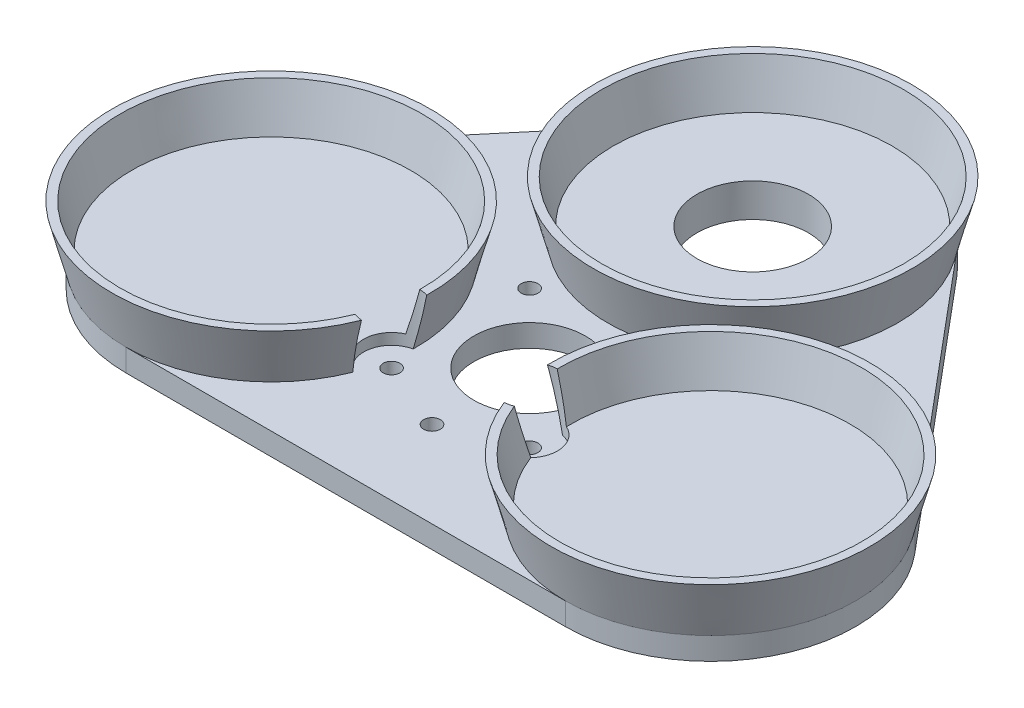
ISO-10303-21;
HEADER;
FILE_DESCRIPTION(('STEP AP214'),'2;1');
FILE_NAME('part.step','',(''),(''),'','','');
FILE_SCHEMA(('AUTOMOTIVE_DESIGN { 1 0 10303 214 1 1 1 1 }'));
ENDSEC;
DATA;
#1=APPLICATION_CONTEXT('core data for automotive mechanical design processes');
#2=APPLICATION_PROTOCOL_DEFINITION('international standard','automotive_design',2000,#1);
#3=PRODUCT_CONTEXT('',#1,'mechanical');
#4=PRODUCT('Part','Part','',(#3));
#5=PRODUCT_RELATED_PRODUCT_CATEGORY('part','',(#4));
#6=PRODUCT_DEFINITION_FORMATION('','',#4);
#7=PRODUCT_DEFINITION_CONTEXT('part definition',#1,'design');
#8=PRODUCT_DEFINITION('design','',#6,#7);
#9=PRODUCT_DEFINITION_SHAPE('','',#8);
#10=(LENGTH_UNIT() NAMED_UNIT(*) SI_UNIT(.MILLI.,.METRE.));
#11=(NAMED_UNIT(*) PLANE_ANGLE_UNIT() SI_UNIT($,.RADIAN.));
#12=(NAMED_UNIT(*) SI_UNIT($,.STERADIAN.) SOLID_ANGLE_UNIT());
#13=UNCERTAINTY_MEASURE_WITH_UNIT(LENGTH_MEASURE(1.E-05),#10,'distance_accuracy_value','');
#14=(GEOMETRIC_REPRESENTATION_CONTEXT(3) GLOBAL_UNCERTAINTY_ASSIGNED_CONTEXT((#13)) GLOBAL_UNIT_ASSIGNED_CONTEXT((#10,
#11,#12)) REPRESENTATION_CONTEXT('',''));
#15=CARTESIAN_POINT('',(0.,0.,0.));
#16=DIRECTION('',(0.,0.,1.));
#17=DIRECTION('',(1.,0.,0.));
#18=AXIS2_PLACEMENT_3D('',#15,#16,#17);
#19=CARTESIAN_POINT('',(-39.3923101204883,9.72740661031256,6.94592710667736));
#20=DIRECTION('',(0.,1.,0.));
#21=DIRECTION('',(0.984807753012207,0.,-0.173648177666934));
#22=AXIS2_PLACEMENT_3D('',#19,#20,#21);
#23=CONICAL_SURFACE('',#22,27.0705523608201,0.261799387799143);
#24=CARTESIAN_POINT('',(-39.3923101204883,9.72740661031256,6.94592710667736));
#25=DIRECTION('',(0.,-1.,0.));
#26=DIRECTION('',(-0.984807753012207,0.,0.173648177666934));
#27=AXIS2_PLACEMENT_3D('',#24,#25,#26);
#28=CIRCLE('',#27,27.0705523608201);
#29=CARTESIAN_POINT('',(-14.2601151995209,9.72740661031256,17.0051310301697));
#30=VERTEX_POINT('',#29);
#31=CARTESIAN_POINT('',(-12.3251522474625,9.72740661031256,7.37461090226448));
#32=VERTEX_POINT('',#31);
#33=EDGE_CURVE('E308',#30,#32,#28,.T.);
#34=ORIENTED_EDGE('',*,*,#33,.F.);
#35=CARTESIAN_POINT('',(-14.2600655661615,9.72760661031256,17.0051512416364));
#36=CARTESIAN_POINT('',(-14.3401976419316,9.40470816898464,16.9725164342048));
#37=CARTESIAN_POINT('',(-14.4194946879049,9.08181861347852,16.9378063994097));
#38=CARTESIAN_POINT('',(-14.5763991827393,8.43610466329445,16.8641989386838));
#39=CARTESIAN_POINT('',(-14.6540066232355,8.11328026894694,16.8253014920276));
#40=CARTESIAN_POINT('',(-14.8841287600299,7.14554965052471,16.7023454319672));
#41=CARTESIAN_POINT('',(-15.0340845894678,6.50081663974946,16.6119656955683));
#42=CARTESIAN_POINT('',(-15.2536440619608,5.53455915883508,16.4630814499572));
#43=CARTESIAN_POINT('',(-15.3259371332597,5.21260308153801,16.4112323343533));
#44=CARTESIAN_POINT('',(-15.4686712999778,4.5690607059439,16.3028953142026));
#45=CARTESIAN_POINT('',(-15.5391124160984,4.24747440355191,16.2464074615374));
#46=CARTESIAN_POINT('',(-15.6781287462537,3.60450502178904,16.1284991901627));
#47=CARTESIAN_POINT('',(-15.7467023182882,3.28312234942801,16.0670746071887));
#48=CARTESIAN_POINT('',(-15.881820018506,2.64096582360021,15.9389734226375));
#49=CARTESIAN_POINT('',(-15.9483640708069,2.32019199331712,15.8722966250168));
#50=CARTESIAN_POINT('',(-16.0138402851936,1.99979999999994,15.8028153114125));
#51=B_SPLINE_CURVE_WITH_KNOTS('',3,(#35,#36,#37,#38,#39,#40,#41,#42,#43,#44,#45,#46,#47,#48,#49,
#50),.UNSPECIFIED.,.F.,.F.,(4,2,2,2,2,2,2,4),(0.,1.00284888858753,2.00570274092708,
4.00964270612081,5.01167869362062,6.01370347544364,7.0165825465539,8.01949906878574),.UNSPECIFIED.);
#52=CARTESIAN_POINT('',(-16.0137994149528,2.,15.8028586967465));
#53=VERTEX_POINT('',#52);
#54=EDGE_CURVE('E271',#30,#53,#51,.T.);
#55=ORIENTED_EDGE('',*,*,#54,.T.);
#56=CARTESIAN_POINT('',(-39.3923101204883,2.,6.94592710667736));
#57=DIRECTION('',(0.,1.,0.));
#58=DIRECTION('',(0.,0.,1.));
#59=AXIS2_PLACEMENT_3D('',#56,#57,#58);
#60=CIRCLE('',#59,25.);
#61=CARTESIAN_POINT('',(-14.4071167597604,2.,7.80622515214748));
#62=VERTEX_POINT('',#61);
#63=EDGE_CURVE('E179',#53,#62,#60,.F.);
#64=ORIENTED_EDGE('',*,*,#63,.T.);
#65=CARTESIAN_POINT('',(-14.4071712157484,1.99980000000009,7.80624938454765));
#66=CARTESIAN_POINT('',(-14.3199392909982,2.32019199331719,7.76745017199079));
#67=CARTESIAN_POINT('',(-14.2328056347191,2.64096582360024,7.7316502811942));
#68=CARTESIAN_POINT('',(-14.0586949629365,3.28312234942802,7.66567922415418));
#69=CARTESIAN_POINT('',(-13.9717179417051,3.60450502178906,7.63550784777165));
#70=CARTESIAN_POINT('',(-13.797948178705,4.24747440355194,7.58044452081705));
#71=CARTESIAN_POINT('',(-13.711155343073,4.56906070594392,7.55554809492899));
#72=CARTESIAN_POINT('',(-13.5376531364761,5.21260308153803,7.51074924907529));
#73=CARTESIAN_POINT('',(-13.4509437664554,5.5345591588351,7.4908468849609));
#74=CARTESIAN_POINT('',(-13.1909170043141,6.50081663974948,7.43832104824259));
#75=CARTESIAN_POINT('',(-13.0176895250381,7.14554965052472,7.41287526357004));
#76=CARTESIAN_POINT('',(-12.7579345065733,8.11328026894694,7.38834526294325));
#77=CARTESIAN_POINT('',(-12.6713257365057,8.43610466329445,7.38244211766939));
#78=CARTESIAN_POINT('',(-12.4981670896661,9.08181861347851,7.37515090388513));
#79=CARTESIAN_POINT('',(-12.4116172126047,9.40470816898464,7.37376281302693));
#80=CARTESIAN_POINT('',(-12.3250986592624,9.72760661031254,7.37461143006116));
#81=B_SPLINE_CURVE_WITH_KNOTS('',3,(#65,#66,#67,#68,#69,#70,#71,#72,#73,#74,#75,#76,#77,#78,#79,
#80),.UNSPECIFIED.,.F.,.F.,(4,2,2,2,2,2,2,4),(0.,1.00291652223184,2.00579559334211,
3.00782037516513,4.00985636266493,6.01379632785865,7.01665018019819,8.01949906878572),.UNSPECIFIED.);
#82=EDGE_CURVE('E58',#62,#32,#81,.T.);
#83=ORIENTED_EDGE('',*,*,#82,.T.);
#84=EDGE_LOOP('',(#34,#55,#64,#83));
#85=FACE_BOUND('',#84,.T.);
#86=ADVANCED_FACE('F42',(#85),#23,.F.);
#87=CARTESIAN_POINT('',(-39.3923101204883,0.,6.94592710667736));
#88=DIRECTION('',(0.,1.,0.));
#89=DIRECTION('',(0.984807753012207,0.,-0.173648177666934));
#90=AXIS2_PLACEMENT_3D('',#87,#88,#89);
#91=CONICAL_SURFACE('',#90,26.,0.25835299681786);
#92=CARTESIAN_POINT('',(-39.3923101204883,9.72740661031256,6.94592710667736));
#93=DIRECTION('',(0.,-1.,0.));
#94=DIRECTION('',(-0.984807753012207,0.,0.173648177666934));
#95=AXIS2_PLACEMENT_3D('',#92,#93,#94);
#96=CIRCLE('',#95,28.5705523608201);
#97=CARTESIAN_POINT('',(-12.7863268878103,9.72740661031256,17.3573688139924));
#98=VERTEX_POINT('',#97);
#99=CARTESIAN_POINT('',(-10.8296860263977,9.72740661031256,7.61895538397324));
#100=VERTEX_POINT('',#99);
#101=EDGE_CURVE('E305',#98,#100,#96,.T.);
#102=ORIENTED_EDGE('',*,*,#101,.T.);
#103=CARTESIAN_POINT('',(-10.8296335615521,9.72760661031256,7.61897242624759));
#104=CARTESIAN_POINT('',(-10.9358008268356,9.32290237362259,7.58450271197082));
#105=CARTESIAN_POINT('',(-11.0421759634996,8.91793216598347,7.55386089376115));
#106=CARTESIAN_POINT('',(-11.2552487514101,8.10759913082861,7.49997745893563));
#107=CARTESIAN_POINT('',(-11.3619463910523,7.70223631778812,7.47673557917915));
#108=CARTESIAN_POINT('',(-11.575459122435,6.89168186058792,7.43741600337432));
#109=CARTESIAN_POINT('',(-11.6822739495732,6.48649053158333,7.42133032827775));
#110=CARTESIAN_POINT('',(-11.8960802866127,5.6759258628861,7.39613300698036));
#111=CARTESIAN_POINT('',(-12.0030718014418,5.27055251835473,7.38702155869862));
#112=CARTESIAN_POINT('',(-12.2172333454675,4.45954758989942,7.37568757244413));
#113=CARTESIAN_POINT('',(-12.3244034359033,4.05391597577354,7.37346836179419));
#114=CARTESIAN_POINT('',(-12.538842428166,3.24269329102045,7.375924611302));
#115=CARTESIAN_POINT('',(-12.6461113314316,2.83710222108201,7.38060017348585));
#116=CARTESIAN_POINT('',(-12.8607411848511,2.02604261623368,7.39691550845988));
#117=CARTESIAN_POINT('',(-12.9681021426842,1.62057409635626,7.40855593340414));
#118=CARTESIAN_POINT('',(-13.1829110265829,0.809933026909339,7.43898842398198));
#119=CARTESIAN_POINT('',(-13.2903589518637,0.404760474730257,7.45778042577766));
#120=CARTESIAN_POINT('',(-13.3978537968684,-0.000199999999996599,7.48024176225027));
#121=B_SPLINE_CURVE_WITH_KNOTS('',3,(#103,#104,#105,#106,#107,#108,#109,#110,#111,#112,#113,
#114,#115,#116,#117,#118,#119,#120),.UNSPECIFIED.,.F.,.F.,(4,2,2,2,2,2,2,2,4),(0.,
1.25942147196068,2.51879815408813,3.77676711135725,5.03477176675054,6.29338364691811,
7.55201415170976,8.81076252666348,10.0694996657777),.UNSPECIFIED.);
#122=CARTESIAN_POINT('',(-13.3978007057474,0.,7.48023065986106));
#123=VERTEX_POINT('',#122);
#124=EDGE_CURVE('E289',#100,#123,#121,.T.);
#125=ORIENTED_EDGE('',*,*,#124,.T.);
#126=CARTESIAN_POINT('',(-39.3923101204883,0.,6.94592710667726));
#127=DIRECTION('',(0.,1.,0.));
#128=DIRECTION('',(0.,0.,1.));
#129=AXIS2_PLACEMENT_3D('',#126,#127,#128);
#130=CIRCLE('',#129,26.);
#131=CARTESIAN_POINT('',(-59.3094656415816,0.,-9.76655074517278));
#132=VERTEX_POINT('',#131);
#133=EDGE_CURVE('E348',#123,#132,#130,.T.);
#134=ORIENTED_EDGE('',*,*,#133,.T.);
#135=CARTESIAN_POINT('',(-39.3923101204883,0.,6.94592710667736));
#136=DIRECTION('',(0.,-1.,0.));
#137=DIRECTION('',(-0.984807753012207,0.,0.173648177666934));
#138=AXIS2_PLACEMENT_3D('',#135,#136,#137);
#139=CIRCLE('',#138,26.);
#140=CARTESIAN_POINT('',(-39.3923101204883,0.,32.9459271066773));
#141=VERTEX_POINT('',#140);
#142=EDGE_CURVE('E302',#141,#132,#139,.T.);
#143=ORIENTED_EDGE('',*,*,#142,.F.);
#144=CARTESIAN_POINT('',(-15.20872564656,0.,16.4934001751063));
#145=VERTEX_POINT('',#144);
#146=EDGE_CURVE('E351',#141,#145,#130,.T.);
#147=ORIENTED_EDGE('',*,*,#146,.T.);
#148=CARTESIAN_POINT('',(-15.2087703292869,-0.000200000000001318,16.4933694280073));
#149=CARTESIAN_POINT('',(-15.1182932317789,0.404760474730253,16.5556072634874));
#150=CARTESIAN_POINT('',(-15.0264421417598,0.809933026909334,16.6144423995962));
#151=CARTESIAN_POINT('',(-14.8400579259285,1.62057409635625,16.7254825597795));
#152=CARTESIAN_POINT('',(-14.745524776183,2.02604261623367,16.7776875246671));
#153=CARTESIAN_POINT('',(-14.5538529823263,2.837102221082,16.8756369380085));
#154=CARTESIAN_POINT('',(-14.4567145830246,3.24269329102044,16.9213819909722));
#155=CARTESIAN_POINT('',(-14.2598658026267,4.05391597577353,17.0064741305631));
#156=CARTESIAN_POINT('',(-14.1601554596108,4.45954758989941,17.0458213118544));
#157=CARTESIAN_POINT('',(-13.9582361532006,5.27055251835472,17.1180862402963));
#158=CARTESIAN_POINT('',(-13.8560284184894,5.67592586288609,17.1510070802069));
#159=CARTESIAN_POINT('',(-13.6490820759568,6.48649053158332,17.2103473369571));
#160=CARTESIAN_POINT('',(-13.5443435400357,6.8916818605879,17.2367669382596));
#161=CARTESIAN_POINT('',(-13.3322133336348,7.70223631778811,17.2829674905972));
#162=CARTESIAN_POINT('',(-13.2248188253362,8.10759913082859,17.3027409795944));
#163=CARTESIAN_POINT('',(-13.0074691677653,8.91793216598344,17.3353379710262));
#164=CARTESIAN_POINT('',(-12.8975139275595,9.32290237362253,17.348161226259));
#165=CARTESIAN_POINT('',(-12.786271911953,9.72760661031244,17.3573733586914));
#166=B_SPLINE_CURVE_WITH_KNOTS('',3,(#148,#149,#150,#151,#152,#153,#154,#155,#156,#157,#158,
#159,#160,#161,#162,#163,#164,#165),.UNSPECIFIED.,.F.,.F.,(4,2,2,2,2,2,2,2,4),(0.,
1.25873713911423,2.51748551406795,3.7761160188596,5.03472789902717,6.29273255442046,
7.55070151168958,8.81007819381702,10.0694996657777),.UNSPECIFIED.);
#167=EDGE_CURVE('E282',#145,#98,#166,.T.);
#168=ORIENTED_EDGE('',*,*,#167,.T.);
#169=EDGE_LOOP('',(#102,#125,#134,#143,#147,#168));
#170=FACE_BOUND('',#169,.T.);
#171=ADVANCED_FACE('F252',(#170),#91,.T.);
#172=CARTESIAN_POINT('',(39.3923101204883,9.72740661031256,6.94592710667736));
#173=DIRECTION('',(0.,1.,0.));
#174=DIRECTION('',(-0.984807753012207,0.,-0.173648177666934));
#175=AXIS2_PLACEMENT_3D('',#172,#173,#174);
#176=CONICAL_SURFACE('',#175,27.0705523608201,0.261799387799143);
#177=CARTESIAN_POINT('',(39.3923101204883,9.72740661031256,6.94592710667736));
#178=DIRECTION('',(0.,-1.,0.));
#179=DIRECTION('',(0.984807753012207,0.,0.173648177666934));
#180=AXIS2_PLACEMENT_3D('',#177,#178,#179);
#181=CIRCLE('',#180,27.0705523608201);
#182=CARTESIAN_POINT('',(12.3251522474625,9.72740661031256,7.37461090226448));
#183=VERTEX_POINT('',#182);
#184=CARTESIAN_POINT('',(14.2601151995209,9.72740661031256,17.0051310301697));
#185=VERTEX_POINT('',#184);
#186=EDGE_CURVE('E194',#183,#185,#181,.T.);
#187=ORIENTED_EDGE('',*,*,#186,.F.);
#188=CARTESIAN_POINT('',(12.3250986592624,9.72760661031256,7.37461143006116));
#189=CARTESIAN_POINT('',(12.4116172126047,9.40470816898464,7.37376281302693));
#190=CARTESIAN_POINT('',(12.4981670896661,9.08181861347852,7.37515090388513));
#191=CARTESIAN_POINT('',(12.6713257365057,8.43610466329446,7.38244211766939));
#192=CARTESIAN_POINT('',(12.7579345065733,8.11328026894696,7.38834526294325));
#193=CARTESIAN_POINT('',(13.0176895250381,7.14554965052474,7.41287526357004));
#194=CARTESIAN_POINT('',(13.1909170043141,6.5008166397495,7.43832104824259));
#195=CARTESIAN_POINT('',(13.4509437664554,5.53455915883512,7.4908468849609));
#196=CARTESIAN_POINT('',(13.5376531364761,5.21260308153806,7.51074924907529));
#197=CARTESIAN_POINT('',(13.711155343073,4.56906070594395,7.55554809492898));
#198=CARTESIAN_POINT('',(13.797948178705,4.24747440355197,7.58044452081703));
#199=CARTESIAN_POINT('',(13.9717179417051,3.6045050217891,7.63550784777166));
#200=CARTESIAN_POINT('',(14.0586949629365,3.28312234942807,7.66567922415423));
#201=CARTESIAN_POINT('',(14.2328056347191,2.64096582360028,7.73165028119414));
#202=CARTESIAN_POINT('',(14.3199392909981,2.3201919933172,7.76745017199057));
#203=CARTESIAN_POINT('',(14.4071712157481,1.99980000000002,7.80624938454705));
#204=B_SPLINE_CURVE_WITH_KNOTS('',3,(#188,#189,#190,#191,#192,#193,#194,#195,#196,#197,#198,
#199,#200,#201,#202,#203),.UNSPECIFIED.,.F.,.F.,(4,2,2,2,2,2,2,4),(0.,1.00284888858752,
2.00570274092706,4.00964270612077,5.01167869362056,6.01370347544357,7.01658254655383,
8.01949906878565),.UNSPECIFIED.);
#205=CARTESIAN_POINT('',(14.4071167597604,2.,7.80622515214748));
#206=VERTEX_POINT('',#205);
#207=EDGE_CURVE('E193',#183,#206,#204,.T.);
#208=ORIENTED_EDGE('',*,*,#207,.T.);
#209=CARTESIAN_POINT('',(39.3923101204883,2.,6.94592710667736));
#210=DIRECTION('',(0.,1.,0.));
#211=DIRECTION('',(0.,0.,1.));
#212=AXIS2_PLACEMENT_3D('',#209,#210,#211);
#213=CIRCLE('',#212,25.);
#214=CARTESIAN_POINT('',(16.0137994149528,2.,15.8028586967465));
#215=VERTEX_POINT('',#214);
#216=EDGE_CURVE('E182',#206,#215,#213,.F.);
#217=ORIENTED_EDGE('',*,*,#216,.T.);
#218=CARTESIAN_POINT('',(16.0138402851936,1.99980000000001,15.8028153114118));
#219=CARTESIAN_POINT('',(15.9483640708069,2.32019199331711,15.8722966250165));
#220=CARTESIAN_POINT('',(15.881820018506,2.64096582360017,15.9389734226375));
#221=CARTESIAN_POINT('',(15.7467023182882,3.28312234942795,16.0670746071887));
#222=CARTESIAN_POINT('',(15.6781287462537,3.604505021789,16.1284991901627));
#223=CARTESIAN_POINT('',(15.5391124160984,4.24747440355188,16.2464074615374));
#224=CARTESIAN_POINT('',(15.4686712999778,4.56906070594387,16.3028953142026));
#225=CARTESIAN_POINT('',(15.3259371332597,5.21260308153799,16.4112323343533));
#226=CARTESIAN_POINT('',(15.2536440619608,5.53455915883506,16.4630814499572));
#227=CARTESIAN_POINT('',(15.0340845894678,6.50081663974945,16.6119656955683));
#228=CARTESIAN_POINT('',(14.8841287600299,7.14554965052469,16.7023454319672));
#229=CARTESIAN_POINT('',(14.6540066232355,8.11328026894693,16.8253014920276));
#230=CARTESIAN_POINT('',(14.5763991827393,8.43610466329444,16.8641989386838));
#231=CARTESIAN_POINT('',(14.4194946879049,9.08181861347851,16.9378063994097));
#232=CARTESIAN_POINT('',(14.3401976419315,9.40470816898464,16.9725164342048));
#233=CARTESIAN_POINT('',(14.2600655661614,9.72760661031255,17.0051512416365));
#234=B_SPLINE_CURVE_WITH_KNOTS('',3,(#218,#219,#220,#221,#222,#223,#224,#225,#226,#227,#228,
#229,#230,#231,#232,#233),.UNSPECIFIED.,.F.,.F.,(4,2,2,2,2,2,2,4),(0.,1.00291652223185,
2.00579559334213,3.00782037516516,4.00985636266497,6.01379632785871,7.01665018019826,
8.01949906878581),.UNSPECIFIED.);
#235=EDGE_CURVE('E65',#215,#185,#234,.T.);
#236=ORIENTED_EDGE('',*,*,#235,.T.);
#237=EDGE_LOOP('',(#187,#208,#217,#236));
#238=FACE_BOUND('',#237,.T.);
#239=ADVANCED_FACE('F191',(#238),#176,.F.);
#240=CARTESIAN_POINT('',(39.3923101204883,0.,6.94592710667736));
#241=DIRECTION('',(0.,1.,0.));
#242=DIRECTION('',(-0.984807753012207,0.,-0.173648177666934));
#243=AXIS2_PLACEMENT_3D('',#240,#241,#242);
#244=CONICAL_SURFACE('',#243,26.,0.25835299681786);
#245=CARTESIAN_POINT('',(39.3923101204883,9.72740661031256,6.94592710667736));
#246=DIRECTION('',(0.,-1.,0.));
#247=DIRECTION('',(0.984807753012207,0.,0.173648177666934));
#248=AXIS2_PLACEMENT_3D('',#245,#246,#247);
#249=CIRCLE('',#248,28.5705523608201);
#250=CARTESIAN_POINT('',(10.8296860263977,9.72740661031256,7.61895538397324));
#251=VERTEX_POINT('',#250);
#252=CARTESIAN_POINT('',(12.7863268878103,9.72740661031256,17.3573688139924));
#253=VERTEX_POINT('',#252);
#254=EDGE_CURVE('E160',#251,#253,#249,.T.);
#255=ORIENTED_EDGE('',*,*,#254,.T.);
#256=CARTESIAN_POINT('',(12.7862719119533,9.72760661031255,17.3573733586912));
#257=CARTESIAN_POINT('',(12.8975139275596,9.32290237362257,17.3481612262589));
#258=CARTESIAN_POINT('',(13.0074691677654,8.91793216598346,17.3353379710262));
#259=CARTESIAN_POINT('',(13.2248188253362,8.10759913082859,17.3027409795944));
#260=CARTESIAN_POINT('',(13.3322133336348,7.70223631778811,17.2829674905972));
#261=CARTESIAN_POINT('',(13.5443435400357,6.8916818605879,17.2367669382596));
#262=CARTESIAN_POINT('',(13.6490820759568,6.48649053158332,17.2103473369571));
#263=CARTESIAN_POINT('',(13.8560284184894,5.67592586288609,17.1510070802069));
#264=CARTESIAN_POINT('',(13.9582361532006,5.27055251835472,17.1180862402963));
#265=CARTESIAN_POINT('',(14.1601554596108,4.45954758989941,17.0458213118544));
#266=CARTESIAN_POINT('',(14.2598658026267,4.05391597577353,17.0064741305631));
#267=CARTESIAN_POINT('',(14.4567145830246,3.24269329102044,16.9213819909721));
#268=CARTESIAN_POINT('',(14.5538529823263,2.83710222108201,16.8756369380085));
#269=CARTESIAN_POINT('',(14.745524776183,2.02604261623367,16.7776875246671));
#270=CARTESIAN_POINT('',(14.8400579259285,1.62057409635626,16.7254825597795));
#271=CARTESIAN_POINT('',(15.0264421417598,0.809933026909338,16.6144423995962));
#272=CARTESIAN_POINT('',(15.1182932317789,0.404760474730255,16.5556072634874));
#273=CARTESIAN_POINT('',(15.2087703292869,-0.000199999999999226,16.4933694280073));
#274=B_SPLINE_CURVE_WITH_KNOTS('',3,(#256,#257,#258,#259,#260,#261,#262,#263,#264,#265,#266,
#267,#268,#269,#270,#271,#272,#273),.UNSPECIFIED.,.F.,.F.,(4,2,2,2,2,2,2,2,4),(0.,
1.25942147196068,2.51879815408812,3.77676711135725,5.03477176675053,6.2933836469181,
7.55201415170975,8.81076252666347,10.0694996657777),.UNSPECIFIED.);
#275=CARTESIAN_POINT('',(15.20872564656,0.,16.4934001751063));
#276=VERTEX_POINT('',#275);
#277=EDGE_CURVE('E144',#253,#276,#274,.T.);
#278=ORIENTED_EDGE('',*,*,#277,.T.);
#279=CARTESIAN_POINT('',(39.3923101204883,0.,6.94592710667723));
#280=DIRECTION('',(0.,-1.,0.));
#281=DIRECTION('',(0.,0.,-1.));
#282=AXIS2_PLACEMENT_3D('',#279,#280,#281);
#283=CIRCLE('',#282,26.);
#284=CARTESIAN_POINT('',(39.3923101204883,0.,32.9459271066774));
#285=VERTEX_POINT('',#284);
#286=EDGE_CURVE('E157',#276,#285,#283,.F.);
#287=ORIENTED_EDGE('',*,*,#286,.T.);
#288=CARTESIAN_POINT('',(39.3923101204883,0.,6.94592710667736));
#289=DIRECTION('',(0.,-1.,0.));
#290=DIRECTION('',(0.984807753012207,0.,0.173648177666934));
#291=AXIS2_PLACEMENT_3D('',#288,#289,#290);
#292=CIRCLE('',#291,26.);
#293=CARTESIAN_POINT('',(59.3094656415818,0.,-9.76655074517292));
#294=VERTEX_POINT('',#293);
#295=EDGE_CURVE('E298',#294,#285,#292,.T.);
#296=ORIENTED_EDGE('',*,*,#295,.F.);
#297=CARTESIAN_POINT('',(13.3978007057474,0.,7.48023065986106));
#298=VERTEX_POINT('',#297);
#299=EDGE_CURVE('E168',#294,#298,#283,.F.);
#300=ORIENTED_EDGE('',*,*,#299,.T.);
#301=CARTESIAN_POINT('',(13.3978537968684,-0.000199999999999493,7.48024176225027));
#302=CARTESIAN_POINT('',(13.2903589518637,0.404760474730254,7.45778042577766));
#303=CARTESIAN_POINT('',(13.1829110265829,0.809933026909337,7.43898842398198));
#304=CARTESIAN_POINT('',(12.9681021426842,1.62057409635626,7.40855593340414));
#305=CARTESIAN_POINT('',(12.8607411848511,2.02604261623368,7.39691550845988));
#306=CARTESIAN_POINT('',(12.6461113314316,2.83710222108201,7.38060017348585));
#307=CARTESIAN_POINT('',(12.538842428166,3.24269329102044,7.375924611302));
#308=CARTESIAN_POINT('',(12.3244034359033,4.05391597577353,7.37346836179419));
#309=CARTESIAN_POINT('',(12.2172333454675,4.45954758989941,7.37568757244413));
#310=CARTESIAN_POINT('',(12.0030718014418,5.27055251835472,7.38702155869862));
#311=CARTESIAN_POINT('',(11.8960802866127,5.6759258628861,7.39613300698036));
#312=CARTESIAN_POINT('',(11.6822739495732,6.48649053158332,7.42133032827774));
#313=CARTESIAN_POINT('',(11.575459122435,6.89168186058791,7.43741600337431));
#314=CARTESIAN_POINT('',(11.3619463910523,7.70223631778811,7.47673557917915));
#315=CARTESIAN_POINT('',(11.2552487514102,8.1075991308286,7.49997745893564));
#316=CARTESIAN_POINT('',(11.0421759634996,8.91793216598345,7.55386089376114));
#317=CARTESIAN_POINT('',(10.9358008268355,9.32290237362254,7.58450271197079));
#318=CARTESIAN_POINT('',(10.8296335615518,9.72760661031245,7.61897242624751));
#319=B_SPLINE_CURVE_WITH_KNOTS('',3,(#301,#302,#303,#304,#305,#306,#307,#308,#309,#310,#311,
#312,#313,#314,#315,#316,#317,#318),.UNSPECIFIED.,.F.,.F.,(4,2,2,2,2,2,2,2,4),(0.,
1.25873713911424,2.51748551406796,3.77611601885961,5.03472789902718,6.29273255442047,
7.55070151168959,8.81007819381703,10.0694996657777),.UNSPECIFIED.);
#320=EDGE_CURVE('E147',#298,#251,#319,.T.);
#321=ORIENTED_EDGE('',*,*,#320,.T.);
#322=EDGE_LOOP('',(#255,#278,#287,#296,#300,#321));
#323=FACE_BOUND('',#322,.T.);
#324=ADVANCED_FACE('F155',(#323),#244,.T.);
#325=CARTESIAN_POINT('',(0.,2.,-40.));
#326=DIRECTION('',(0.,-1.,0.));
#327=DIRECTION('',(0.,0.,-1.));
#328=AXIS2_PLACEMENT_3D('',#325,#326,#327);
#329=CYLINDRICAL_SURFACE('',#328,26.);
#330=DIRECTION('',(0.,1.,0.));
#331=VECTOR('',#330,1.);
#332=CARTESIAN_POINT('',(-19.9171555210934,-4.,-56.71247785185));
#333=LINE('',#332,#331);
#334=CARTESIAN_POINT('',(-19.9171555210934,-4.,-56.71247785185));
#335=VERTEX_POINT('',#334);
#336=CARTESIAN_POINT('',(-19.9171555210934,0.,-56.71247785185));
#337=VERTEX_POINT('',#336);
#338=EDGE_CURVE('E375',#335,#337,#333,.T.);
#339=ORIENTED_EDGE('',*,*,#338,.T.);
#340=CARTESIAN_POINT('',(0.,0.,-40.));
#341=DIRECTION('',(0.,-1.,0.));
#342=DIRECTION('',(0.,0.,-1.));
#343=AXIS2_PLACEMENT_3D('',#340,#341,#342);
#344=CIRCLE('',#343,26.);
#345=CARTESIAN_POINT('',(19.9171555210934,0.,-56.7124778518501));
#346=VERTEX_POINT('',#345);
#347=EDGE_CURVE('E311',#337,#346,#344,.T.);
#348=ORIENTED_EDGE('',*,*,#347,.T.);
#349=DIRECTION('',(0.,1.,0.));
#350=VECTOR('',#349,1.);
#351=CARTESIAN_POINT('',(19.9171555210934,-4.,-56.71247785185));
#352=LINE('',#351,#350);
#353=CARTESIAN_POINT('',(19.9171555210934,-4.,-56.71247785185));
#354=VERTEX_POINT('',#353);
#355=EDGE_CURVE('E173',#354,#346,#352,.T.);
#356=ORIENTED_EDGE('',*,*,#355,.F.);
#357=CARTESIAN_POINT('',(0.,-4.,-40.));
#358=DIRECTION('',(0.,-1.,0.));
#359=DIRECTION('',(0.,0.,-1.));
#360=AXIS2_PLACEMENT_3D('',#357,#358,#359);
#361=CIRCLE('',#360,26.);
#362=EDGE_CURVE('E358',#354,#335,#361,.F.);
#363=ORIENTED_EDGE('',*,*,#362,.T.);
#364=EDGE_LOOP('',(#339,#348,#356,#363));
#365=FACE_BOUND('',#364,.T.);
#366=ADVANCED_FACE('F44',(#365),#329,.T.);
#367=CARTESIAN_POINT('',(39.6133105813376,-4.,-33.2395142985116));
#368=DIRECTION('',(0.766044443118976,0.,-0.642787609686542));
#369=DIRECTION('',(-0.642787609686542,0.,-0.766044443118976));
#370=AXIS2_PLACEMENT_3D('',#367,#368,#369);
#371=PLANE('',#370);
#372=DIRECTION('',(-0.642787609686542,0.,-0.766044443118976));
#373=VECTOR('',#372,1.);
#374=CARTESIAN_POINT('',(39.6133105813376,0.,-33.2395142985116));
#375=LINE('',#374,#373);
#376=EDGE_CURVE('E378',#294,#346,#375,.T.);
#377=ORIENTED_EDGE('',*,*,#376,.F.);
#378=DIRECTION('',(0.,1.,0.));
#379=VECTOR('',#378,1.);
#380=CARTESIAN_POINT('',(59.3094656415818,-4.,-9.76655074517292));
#381=LINE('',#380,#379);
#382=CARTESIAN_POINT('',(59.3094656415818,-4.,-9.76655074517292));
#383=VERTEX_POINT('',#382);
#384=EDGE_CURVE('E394',#383,#294,#381,.T.);
#385=ORIENTED_EDGE('',*,*,#384,.F.);
#386=DIRECTION('',(-0.642787609686542,0.,-0.766044443118976));
#387=VECTOR('',#386,1.);
#388=CARTESIAN_POINT('',(39.6133105813376,-4.,-33.2395142985116));
#389=LINE('',#388,#387);
#390=EDGE_CURVE('E362',#383,#354,#389,.T.);
#391=ORIENTED_EDGE('',*,*,#390,.T.);
#392=ORIENTED_EDGE('',*,*,#355,.T.);
#393=EDGE_LOOP('',(#377,#385,#391,#392));
#394=FACE_BOUND('',#393,.T.);
#395=ADVANCED_FACE('F398',(#394),#371,.T.);
#396=CARTESIAN_POINT('',(39.3923101204883,-4.,6.94592710667723));
#397=DIRECTION('',(0.,1.,0.));
#398=DIRECTION('',(0.,0.,1.));
#399=AXIS2_PLACEMENT_3D('',#396,#397,#398);
#400=CYLINDRICAL_SURFACE('',#399,26.);
#401=ORIENTED_EDGE('',*,*,#384,.T.);
#402=ORIENTED_EDGE('',*,*,#295,.T.);
#403=DIRECTION('',(0.,1.,0.));
#404=VECTOR('',#403,1.);
#405=CARTESIAN_POINT('',(39.3923101204883,-4.,32.9459271066772));
#406=LINE('',#405,#404);
#407=CARTESIAN_POINT('',(39.3923101204883,-4.,32.9459271066772));
#408=VERTEX_POINT('',#407);
#409=EDGE_CURVE('E392',#408,#285,#406,.T.);
#410=ORIENTED_EDGE('',*,*,#409,.F.);
#411=CARTESIAN_POINT('',(39.3923101204883,-4.,6.94592710667723));
#412=DIRECTION('',(0.,-1.,0.));
#413=DIRECTION('',(0.,0.,-1.));
#414=AXIS2_PLACEMENT_3D('',#411,#412,#413);
#415=CIRCLE('',#414,26.);
#416=EDGE_CURVE('E365',#383,#408,#415,.T.);
#417=ORIENTED_EDGE('',*,*,#416,.F.);
#418=EDGE_LOOP('',(#401,#402,#410,#417));
#419=FACE_BOUND('',#418,.T.);
#420=ADVANCED_FACE('F463',(#419),#400,.T.);
#421=CARTESIAN_POINT('',(0.,-4.,32.9459271066773));
#422=DIRECTION('',(0.,0.,1.));
#423=DIRECTION('',(1.,0.,0.));
#424=AXIS2_PLACEMENT_3D('',#421,#422,#423);
#425=PLANE('',#424);
#426=DIRECTION('',(1.,0.,0.));
#427=VECTOR('',#426,1.);
#428=CARTESIAN_POINT('',(0.,0.,32.9459271066773));
#429=LINE('',#428,#427);
#430=EDGE_CURVE('E166',#141,#285,#429,.T.);
#431=ORIENTED_EDGE('',*,*,#430,.F.);
#432=DIRECTION('',(0.,1.,0.));
#433=VECTOR('',#432,1.);
#434=CARTESIAN_POINT('',(-39.3923101204883,-4.,32.9459271066773));
#435=LINE('',#434,#433);
#436=CARTESIAN_POINT('',(-39.3923101204883,-4.,32.9459271066773));
#437=VERTEX_POINT('',#436);
#438=EDGE_CURVE('E389',#437,#141,#435,.T.);
#439=ORIENTED_EDGE('',*,*,#438,.F.);
#440=DIRECTION('',(1.,0.,0.));
#441=VECTOR('',#440,1.);
#442=CARTESIAN_POINT('',(0.,-4.,32.9459271066773));
#443=LINE('',#442,#441);
#444=EDGE_CURVE('E367',#437,#408,#443,.T.);
#445=ORIENTED_EDGE('',*,*,#444,.T.);
#446=ORIENTED_EDGE('',*,*,#409,.T.);
#447=EDGE_LOOP('',(#431,#439,#445,#446));
#448=FACE_BOUND('',#447,.T.);
#449=ADVANCED_FACE('F459',(#448),#425,.T.);
#450=CARTESIAN_POINT('',(-39.3923101204883,-4.,6.94592710667726));
#451=DIRECTION('',(0.,1.,0.));
#452=DIRECTION('',(0.,0.,1.));
#453=AXIS2_PLACEMENT_3D('',#450,#451,#452);
#454=CYLINDRICAL_SURFACE('',#453,26.0000000000001);
#455=ORIENTED_EDGE('',*,*,#142,.T.);
#456=DIRECTION('',(0.,1.,0.));
#457=VECTOR('',#456,1.);
#458=CARTESIAN_POINT('',(-59.3094656415819,-4.,-9.76655074517291));
#459=LINE('',#458,#457);
#460=CARTESIAN_POINT('',(-59.3094656415819,-4.,-9.76655074517291));
#461=VERTEX_POINT('',#460);
#462=EDGE_CURVE('E386',#461,#132,#459,.T.);
#463=ORIENTED_EDGE('',*,*,#462,.F.);
#464=CARTESIAN_POINT('',(-39.3923101204883,-4.,6.94592710667726));
#465=DIRECTION('',(0.,-1.,0.));
#466=DIRECTION('',(0.,0.,-1.));
#467=AXIS2_PLACEMENT_3D('',#464,#465,#466);
#468=CIRCLE('',#467,26.0000000000001);
#469=EDGE_CURVE('E370',#461,#437,#468,.F.);
#470=ORIENTED_EDGE('',*,*,#469,.T.);
#471=ORIENTED_EDGE('',*,*,#438,.T.);
#472=EDGE_LOOP('',(#455,#463,#470,#471));
#473=FACE_BOUND('',#472,.T.);
#474=ADVANCED_FACE('F456',(#473),#454,.T.);
#475=CARTESIAN_POINT('',(0.,-4.,0.));
#476=DIRECTION('',(0.,1.,0.));
#477=DIRECTION('',(0.,0.,1.));
#478=AXIS2_PLACEMENT_3D('',#475,#476,#477);
#479=CYLINDRICAL_SURFACE('',#478,10.);
#480=CARTESIAN_POINT('',(0.,-4.,0.));
#481=DIRECTION('',(0.,-1.,0.));
#482=DIRECTION('',(0.,0.,-1.));
#483=AXIS2_PLACEMENT_3D('',#480,#481,#482);
#484=CIRCLE('',#483,10.);
#485=CARTESIAN_POINT('',(0.,-4.,-10.));
#486=VERTEX_POINT('',#485);
#487=EDGE_CURVE('E355',#486,#486,#484,.T.);
#488=ORIENTED_EDGE('',*,*,#487,.T.);
#489=EDGE_LOOP('',(#488));
#490=FACE_BOUND('',#489,.T.);
#491=CARTESIAN_POINT('',(0.,0.,0.));
#492=DIRECTION('',(0.,-1.,0.));
#493=DIRECTION('',(0.,0.,-1.));
#494=AXIS2_PLACEMENT_3D('',#491,#492,#493);
#495=CIRCLE('',#494,10.);
#496=CARTESIAN_POINT('',(0.,0.,-10.));
#497=VERTEX_POINT('',#496);
#498=EDGE_CURVE('E354',#497,#497,#495,.T.);
#499=ORIENTED_EDGE('',*,*,#498,.F.);
#500=EDGE_LOOP('',(#499));
#501=FACE_BOUND('',#500,.T.);
#502=ADVANCED_FACE('F454',(#490,#501),#479,.F.);
#503=CARTESIAN_POINT('',(-39.6133105813376,-4.,-33.2395142985116));
#504=DIRECTION('',(0.766044443118976,0.,0.642787609686542));
#505=DIRECTION('',(0.642787609686542,0.,-0.766044443118976));
#506=AXIS2_PLACEMENT_3D('',#503,#504,#505);
#507=PLANE('',#506);
#508=DIRECTION('',(0.642787609686542,0.,-0.766044443118976));
#509=VECTOR('',#508,1.);
#510=CARTESIAN_POINT('',(-39.6133105813376,0.,-33.2395142985116));
#511=LINE('',#510,#509);
#512=EDGE_CURVE('E359',#132,#337,#511,.T.);
#513=ORIENTED_EDGE('',*,*,#512,.T.);
#514=ORIENTED_EDGE('',*,*,#338,.F.);
#515=DIRECTION('',(0.642787609686542,0.,-0.766044443118976));
#516=VECTOR('',#515,1.);
#517=CARTESIAN_POINT('',(-39.6133105813376,-4.,-33.2395142985116));
#518=LINE('',#517,#516);
#519=EDGE_CURVE('E373',#461,#335,#518,.T.);
#520=ORIENTED_EDGE('',*,*,#519,.F.);
#521=ORIENTED_EDGE('',*,*,#462,.T.);
#522=EDGE_LOOP('',(#513,#514,#520,#521));
#523=FACE_BOUND('',#522,.T.);
#524=ADVANCED_FACE('F448',(#523),#507,.F.);
#525=CARTESIAN_POINT('',(0.,-4.,0.));
#526=DIRECTION('',(0.,-1.,0.));
#527=DIRECTION('',(0.,0.,-1.));
#528=AXIS2_PLACEMENT_3D('',#525,#526,#527);
#529=PLANE('',#528);
#530=CARTESIAN_POINT('',(0.,-4.,-40.));
#531=DIRECTION('',(0.,-1.,0.));
#532=DIRECTION('',(0.,0.,-1.));
#533=AXIS2_PLACEMENT_3D('',#530,#531,#532);
#534=CIRCLE('',#533,10.);
#535=CARTESIAN_POINT('',(0.,-4.,-50.));
#536=VERTEX_POINT('',#535);
#537=EDGE_CURVE('E46',#536,#536,#534,.T.);
#538=ORIENTED_EDGE('',*,*,#537,.F.);
#539=EDGE_LOOP('',(#538));
#540=FACE_BOUND('',#539,.T.);
#541=CARTESIAN_POINT('',(0.,-4.,17.5));
#542=DIRECTION('',(0.,1.,0.));
#543=DIRECTION('',(0.,0.,1.));
#544=AXIS2_PLACEMENT_3D('',#541,#542,#543);
#545=CIRCLE('',#544,1.5);
#546=CARTESIAN_POINT('',(0.,-4.,19.));
#547=VERTEX_POINT('',#546);
#548=EDGE_CURVE('E337',#547,#547,#545,.T.);
#549=ORIENTED_EDGE('',*,*,#548,.T.);
#550=EDGE_LOOP('',(#549));
#551=FACE_BOUND('',#550,.T.);
#552=CARTESIAN_POINT('',(-12.3743686707646,-4.,-12.3743686707646));
#553=DIRECTION('',(0.,1.,0.));
#554=DIRECTION('',(0.,0.,-1.));
#555=AXIS2_PLACEMENT_3D('',#552,#553,#554);
#556=CIRCLE('',#555,1.5);
#557=CARTESIAN_POINT('',(-12.3743686707646,-4.,-13.8743686707646));
#558=VERTEX_POINT('',#557);
#559=EDGE_CURVE('E324',#558,#558,#556,.T.);
#560=ORIENTED_EDGE('',*,*,#559,.T.);
#561=EDGE_LOOP('',(#560));
#562=FACE_BOUND('',#561,.T.);
#563=CARTESIAN_POINT('',(-12.3743686707646,-4.,12.3743686707646));
#564=DIRECTION('',(0.,1.,0.));
#565=DIRECTION('',(0.,0.,1.));
#566=AXIS2_PLACEMENT_3D('',#563,#564,#565);
#567=CIRCLE('',#566,1.5);
#568=CARTESIAN_POINT('',(-12.3743686707646,-4.,13.8743686707646));
#569=VERTEX_POINT('',#568);
#570=EDGE_CURVE('E325',#569,#569,#567,.T.);
#571=ORIENTED_EDGE('',*,*,#570,.T.);
#572=EDGE_LOOP('',(#571));
#573=FACE_BOUND('',#572,.T.);
#574=CARTESIAN_POINT('',(12.3743686707646,-4.,12.3743686707646));
#575=DIRECTION('',(0.,1.,0.));
#576=DIRECTION('',(0.,0.,-1.));
#577=AXIS2_PLACEMENT_3D('',#574,#575,#576);
#578=CIRCLE('',#577,1.5);
#579=CARTESIAN_POINT('',(12.3743686707646,-4.,10.8743686707646));
#580=VERTEX_POINT('',#579);
#581=EDGE_CURVE('E320',#580,#580,#578,.T.);
#582=ORIENTED_EDGE('',*,*,#581,.T.);
#583=EDGE_LOOP('',(#582));
#584=FACE_BOUND('',#583,.T.);
#585=CARTESIAN_POINT('',(12.3743686707646,-4.,-12.3743686707646));
#586=DIRECTION('',(0.,1.,0.));
#587=DIRECTION('',(0.,0.,1.));
#588=AXIS2_PLACEMENT_3D('',#585,#586,#587);
#589=CIRCLE('',#588,1.5);
#590=CARTESIAN_POINT('',(12.3743686707646,-4.,-10.8743686707646));
#591=VERTEX_POINT('',#590);
#592=EDGE_CURVE('E345',#591,#591,#589,.T.);
#593=ORIENTED_EDGE('',*,*,#592,.T.);
#594=EDGE_LOOP('',(#593));
#595=FACE_BOUND('',#594,.T.);
#596=ORIENTED_EDGE('',*,*,#487,.F.);
#597=EDGE_LOOP('',(#596));
#598=FACE_BOUND('',#597,.T.);
#599=ORIENTED_EDGE('',*,*,#362,.F.);
#600=ORIENTED_EDGE('',*,*,#390,.F.);
#601=ORIENTED_EDGE('',*,*,#416,.T.);
#602=ORIENTED_EDGE('',*,*,#444,.F.);
#603=ORIENTED_EDGE('',*,*,#469,.F.);
#604=ORIENTED_EDGE('',*,*,#519,.T.);
#605=EDGE_LOOP('',(#599,#600,#601,#602,#603,#604));
#606=FACE_BOUND('',#605,.T.);
#607=ADVANCED_FACE('F445',(#540,#551,#562,#573,#584,#595,#598,#606),#529,.T.);
#608=CARTESIAN_POINT('',(0.,0.,0.));
#609=DIRECTION('',(0.,-1.,0.));
#610=DIRECTION('',(0.,0.,-1.));
#611=AXIS2_PLACEMENT_3D('',#608,#609,#610);
#612=PLANE('',#611);
#613=ORIENTED_EDGE('',*,*,#286,.F.);
#614=CARTESIAN_POINT('',(12.3743686707646,0.,12.3743686707646));
#615=DIRECTION('',(0.,1.,0.));
#616=DIRECTION('',(0.,0.,1.));
#617=AXIS2_PLACEMENT_3D('',#614,#615,#616);
#618=CIRCLE('',#617,5.);
#619=EDGE_CURVE('E141',#276,#298,#618,.T.);
#620=ORIENTED_EDGE('',*,*,#619,.T.);
#621=ORIENTED_EDGE('',*,*,#299,.F.);
#622=ORIENTED_EDGE('',*,*,#376,.T.);
#623=CARTESIAN_POINT('',(0.,0.,-40.));
#624=DIRECTION('',(0.,1.,0.));
#625=DIRECTION('',(0.,0.,1.));
#626=AXIS2_PLACEMENT_3D('',#623,#624,#625);
#627=CIRCLE('',#626,26.);
#628=EDGE_CURVE('E169',#337,#346,#627,.T.);
#629=ORIENTED_EDGE('',*,*,#628,.F.);
#630=ORIENTED_EDGE('',*,*,#512,.F.);
#631=ORIENTED_EDGE('',*,*,#133,.F.);
#632=CARTESIAN_POINT('',(-12.3743686707646,0.,12.3743686707646));
#633=DIRECTION('',(0.,1.,0.));
#634=DIRECTION('',(0.,0.,-1.));
#635=AXIS2_PLACEMENT_3D('',#632,#633,#634);
#636=CIRCLE('',#635,5.);
#637=EDGE_CURVE('E151',#123,#145,#636,.T.);
#638=ORIENTED_EDGE('',*,*,#637,.T.);
#639=ORIENTED_EDGE('',*,*,#146,.F.);
#640=ORIENTED_EDGE('',*,*,#430,.T.);
#641=EDGE_LOOP('',(#613,#620,#621,#622,#629,#630,#631,#638,#639,#640));
#642=FACE_BOUND('',#641,.T.);
#643=CARTESIAN_POINT('',(0.,0.,17.5));
#644=DIRECTION('',(0.,1.,0.));
#645=DIRECTION('',(0.,0.,1.));
#646=AXIS2_PLACEMENT_3D('',#643,#644,#645);
#647=CIRCLE('',#646,1.5);
#648=CARTESIAN_POINT('',(0.,0.,19.));
#649=VERTEX_POINT('',#648);
#650=EDGE_CURVE('E333',#649,#649,#647,.T.);
#651=ORIENTED_EDGE('',*,*,#650,.F.);
#652=EDGE_LOOP('',(#651));
#653=FACE_BOUND('',#652,.T.);
#654=CARTESIAN_POINT('',(-12.3743686707646,0.,-12.3743686707646));
#655=DIRECTION('',(0.,1.,0.));
#656=DIRECTION('',(0.,0.,-1.));
#657=AXIS2_PLACEMENT_3D('',#654,#655,#656);
#658=CIRCLE('',#657,1.5);
#659=CARTESIAN_POINT('',(-12.3743686707646,0.,-13.8743686707646));
#660=VERTEX_POINT('',#659);
#661=EDGE_CURVE('E340',#660,#660,#658,.T.);
#662=ORIENTED_EDGE('',*,*,#661,.F.);
#663=EDGE_LOOP('',(#662));
#664=FACE_BOUND('',#663,.T.);
#665=CARTESIAN_POINT('',(12.3743686707646,0.,-12.3743686707646));
#666=DIRECTION('',(0.,1.,0.));
#667=DIRECTION('',(0.,0.,1.));
#668=AXIS2_PLACEMENT_3D('',#665,#666,#667);
#669=CIRCLE('',#668,1.5);
#670=CARTESIAN_POINT('',(12.3743686707646,0.,-10.8743686707646));
#671=VERTEX_POINT('',#670);
#672=EDGE_CURVE('E336',#671,#671,#669,.T.);
#673=ORIENTED_EDGE('',*,*,#672,.F.);
#674=EDGE_LOOP('',(#673));
#675=FACE_BOUND('',#674,.T.);
#676=ORIENTED_EDGE('',*,*,#498,.T.);
#677=EDGE_LOOP('',(#676));
#678=FACE_BOUND('',#677,.T.);
#679=CARTESIAN_POINT('',(-12.3743686707646,0.,12.3743686707646));
#680=DIRECTION('',(0.,1.,0.));
#681=DIRECTION('',(0.,0.,1.));
#682=AXIS2_PLACEMENT_3D('',#679,#680,#681);
#683=CIRCLE('',#682,1.5);
#684=CARTESIAN_POINT('',(-12.3743686707646,0.,13.8743686707646));
#685=VERTEX_POINT('',#684);
#686=EDGE_CURVE('E321',#685,#685,#683,.T.);
#687=ORIENTED_EDGE('',*,*,#686,.F.);
#688=EDGE_LOOP('',(#687));
#689=FACE_BOUND('',#688,.T.);
#690=CARTESIAN_POINT('',(12.3743686707646,0.,12.3743686707646));
#691=DIRECTION('',(0.,1.,0.));
#692=DIRECTION('',(0.,0.,-1.));
#693=AXIS2_PLACEMENT_3D('',#690,#691,#692);
#694=CIRCLE('',#693,1.5);
#695=CARTESIAN_POINT('',(12.3743686707646,0.,10.8743686707646));
#696=VERTEX_POINT('',#695);
#697=EDGE_CURVE('E328',#696,#696,#694,.T.);
#698=ORIENTED_EDGE('',*,*,#697,.F.);
#699=EDGE_LOOP('',(#698));
#700=FACE_BOUND('',#699,.T.);
#701=ADVANCED_FACE('F163',(#642,#653,#664,#675,#678,#689,#700),#612,.F.);
#702=CARTESIAN_POINT('',(12.3743686707646,-4.,-12.3743686707646));
#703=DIRECTION('',(0.,1.,0.));
#704=DIRECTION('',(0.,0.,1.));
#705=AXIS2_PLACEMENT_3D('',#702,#703,#704);
#706=CYLINDRICAL_SURFACE('',#705,1.5);
#707=ORIENTED_EDGE('',*,*,#592,.F.);
#708=EDGE_LOOP('',(#707));
#709=FACE_BOUND('',#708,.T.);
#710=ORIENTED_EDGE('',*,*,#672,.T.);
#711=EDGE_LOOP('',(#710));
#712=FACE_BOUND('',#711,.T.);
#713=ADVANCED_FACE('F434',(#709,#712),#706,.F.);
#714=CARTESIAN_POINT('',(12.3743686707646,-4.,12.3743686707646));
#715=DIRECTION('',(0.,1.,0.));
#716=DIRECTION('',(0.,0.,1.));
#717=AXIS2_PLACEMENT_3D('',#714,#715,#716);
#718=CYLINDRICAL_SURFACE('',#717,1.5);
#719=ORIENTED_EDGE('',*,*,#581,.F.);
#720=EDGE_LOOP('',(#719));
#721=FACE_BOUND('',#720,.T.);
#722=ORIENTED_EDGE('',*,*,#697,.T.);
#723=EDGE_LOOP('',(#722));
#724=FACE_BOUND('',#723,.T.);
#725=ADVANCED_FACE('F430',(#721,#724),#718,.F.);
#726=CARTESIAN_POINT('',(-12.3743686707646,-4.,12.3743686707646));
#727=DIRECTION('',(0.,1.,0.));
#728=DIRECTION('',(0.,0.,1.));
#729=AXIS2_PLACEMENT_3D('',#726,#727,#728);
#730=CYLINDRICAL_SURFACE('',#729,1.5);
#731=ORIENTED_EDGE('',*,*,#570,.F.);
#732=EDGE_LOOP('',(#731));
#733=FACE_BOUND('',#732,.T.);
#734=ORIENTED_EDGE('',*,*,#686,.T.);
#735=EDGE_LOOP('',(#734));
#736=FACE_BOUND('',#735,.T.);
#737=ADVANCED_FACE('F426',(#733,#736),#730,.F.);
#738=CARTESIAN_POINT('',(-12.3743686707646,-4.,-12.3743686707646));
#739=DIRECTION('',(0.,1.,0.));
#740=DIRECTION('',(0.,0.,1.));
#741=AXIS2_PLACEMENT_3D('',#738,#739,#740);
#742=CYLINDRICAL_SURFACE('',#741,1.5);
#743=ORIENTED_EDGE('',*,*,#559,.F.);
#744=EDGE_LOOP('',(#743));
#745=FACE_BOUND('',#744,.T.);
#746=ORIENTED_EDGE('',*,*,#661,.T.);
#747=EDGE_LOOP('',(#746));
#748=FACE_BOUND('',#747,.T.);
#749=ADVANCED_FACE('F429',(#745,#748),#742,.F.);
#750=CARTESIAN_POINT('',(0.,-4.,17.5));
#751=DIRECTION('',(0.,1.,0.));
#752=DIRECTION('',(0.,0.,1.));
#753=AXIS2_PLACEMENT_3D('',#750,#751,#752);
#754=CYLINDRICAL_SURFACE('',#753,1.5);
#755=ORIENTED_EDGE('',*,*,#548,.F.);
#756=EDGE_LOOP('',(#755));
#757=FACE_BOUND('',#756,.T.);
#758=ORIENTED_EDGE('',*,*,#650,.T.);
#759=EDGE_LOOP('',(#758));
#760=FACE_BOUND('',#759,.T.);
#761=ADVANCED_FACE('F422',(#757,#760),#754,.F.);
#762=CARTESIAN_POINT('',(0.,9.72740661031256,-40.));
#763=DIRECTION('',(0.,1.,0.));
#764=DIRECTION('',(0.,0.,1.));
#765=AXIS2_PLACEMENT_3D('',#762,#763,#764);
#766=CONICAL_SURFACE('',#765,27.0705523608201,0.261799387799143);
#767=CARTESIAN_POINT('',(0.,2.,-40.));
#768=DIRECTION('',(0.,1.,0.));
#769=DIRECTION('',(0.,0.,1.));
#770=AXIS2_PLACEMENT_3D('',#767,#768,#769);
#771=CIRCLE('',#770,25.);
#772=CARTESIAN_POINT('',(0.,2.,-15.));
#773=VERTEX_POINT('',#772);
#774=EDGE_CURVE('E171',#773,#773,#771,.F.);
#775=ORIENTED_EDGE('',*,*,#774,.T.);
#776=EDGE_LOOP('',(#775));
#777=FACE_BOUND('',#776,.T.);
#778=CARTESIAN_POINT('',(0.,9.72740661031256,-40.));
#779=DIRECTION('',(0.,-1.,0.));
#780=DIRECTION('',(0.,0.,-1.));
#781=AXIS2_PLACEMENT_3D('',#778,#779,#780);
#782=CIRCLE('',#781,27.0705523608201);
#783=CARTESIAN_POINT('',(0.,9.72740661031256,-67.0705523608201));
#784=VERTEX_POINT('',#783);
#785=EDGE_CURVE('E317',#784,#784,#782,.T.);
#786=ORIENTED_EDGE('',*,*,#785,.F.);
#787=EDGE_LOOP('',(#786));
#788=FACE_BOUND('',#787,.T.);
#789=ADVANCED_FACE('F415',(#777,#788),#766,.F.);
#790=CARTESIAN_POINT('',(0.,9.72740661031256,-68.5705523608201));
#791=DIRECTION('',(0.,1.,0.));
#792=DIRECTION('',(0.,0.,1.));
#793=AXIS2_PLACEMENT_3D('',#790,#791,#792);
#794=PLANE('',#793);
#795=ORIENTED_EDGE('',*,*,#785,.T.);
#796=EDGE_LOOP('',(#795));
#797=FACE_BOUND('',#796,.T.);
#798=CARTESIAN_POINT('',(0.,9.72740661031256,-40.));
#799=DIRECTION('',(0.,-1.,0.));
#800=DIRECTION('',(0.,0.,-1.));
#801=AXIS2_PLACEMENT_3D('',#798,#799,#800);
#802=CIRCLE('',#801,28.5705523608201);
#803=CARTESIAN_POINT('',(0.,9.72740661031256,-68.5705523608201));
#804=VERTEX_POINT('',#803);
#805=EDGE_CURVE('E314',#804,#804,#802,.T.);
#806=ORIENTED_EDGE('',*,*,#805,.F.);
#807=EDGE_LOOP('',(#806));
#808=FACE_BOUND('',#807,.T.);
#809=ADVANCED_FACE('F408',(#797,#808),#794,.T.);
#810=CARTESIAN_POINT('',(0.,0.,-40.));
#811=DIRECTION('',(0.,1.,0.));
#812=DIRECTION('',(0.,0.,1.));
#813=AXIS2_PLACEMENT_3D('',#810,#811,#812);
#814=CONICAL_SURFACE('',#813,26.,0.25835299681786);
#815=ORIENTED_EDGE('',*,*,#805,.T.);
#816=EDGE_LOOP('',(#815));
#817=FACE_BOUND('',#816,.T.);
#818=ORIENTED_EDGE('',*,*,#628,.T.);
#819=ORIENTED_EDGE('',*,*,#347,.F.);
#820=EDGE_LOOP('',(#818,#819));
#821=FACE_BOUND('',#820,.T.);
#822=ADVANCED_FACE('F263',(#817,#821),#814,.T.);
#823=CARTESIAN_POINT('',(0.,2.,-40.));
#824=DIRECTION('',(0.,1.,0.));
#825=DIRECTION('',(0.,0.,1.));
#826=AXIS2_PLACEMENT_3D('',#823,#824,#825);
#827=PLANE('',#826);
#828=CARTESIAN_POINT('',(0.,2.,-40.));
#829=DIRECTION('',(0.,1.,0.));
#830=DIRECTION('',(0.,0.,1.));
#831=AXIS2_PLACEMENT_3D('',#828,#829,#830);
#832=CIRCLE('',#831,10.);
#833=CARTESIAN_POINT('',(0.,2.,-30.));
#834=VERTEX_POINT('',#833);
#835=EDGE_CURVE('E497',#834,#834,#832,.T.);
#836=ORIENTED_EDGE('',*,*,#835,.F.);
#837=EDGE_LOOP('',(#836));
#838=FACE_BOUND('',#837,.T.);
#839=ORIENTED_EDGE('',*,*,#774,.F.);
#840=EDGE_LOOP('',(#839));
#841=FACE_BOUND('',#840,.T.);
#842=ADVANCED_FACE('F407',(#838,#841),#827,.T.);
#843=CARTESIAN_POINT('',(-67.5288115932652,9.72740661031256,11.9071514590715));
#844=DIRECTION('',(0.,1.,0.));
#845=DIRECTION('',(0.984807753012207,0.,-0.173648177666934));
#846=AXIS2_PLACEMENT_3D('',#843,#844,#845);
#847=PLANE('',#846);
#848=ORIENTED_EDGE('',*,*,#101,.F.);
#849=CARTESIAN_POINT('',(-12.3743686707646,9.72740661031256,12.3743686707646));
#850=DIRECTION('',(0.,1.,0.));
#851=DIRECTION('',(0.,0.,1.));
#852=AXIS2_PLACEMENT_3D('',#849,#850,#851);
#853=CIRCLE('',#852,5.);
#854=EDGE_CURVE('E281',#98,#30,#853,.F.);
#855=ORIENTED_EDGE('',*,*,#854,.T.);
#856=ORIENTED_EDGE('',*,*,#33,.T.);
#857=EDGE_CURVE('E278',#32,#100,#853,.F.);
#858=ORIENTED_EDGE('',*,*,#857,.T.);
#859=EDGE_LOOP('',(#848,#855,#856,#858));
#860=FACE_BOUND('',#859,.T.);
#861=ADVANCED_FACE('F248',(#860),#847,.T.);
#862=CARTESIAN_POINT('',(-39.3923101204883,2.,6.94592710667726));
#863=DIRECTION('',(0.,1.,0.));
#864=DIRECTION('',(0.,0.,1.));
#865=AXIS2_PLACEMENT_3D('',#862,#863,#864);
#866=PLANE('',#865);
#867=ORIENTED_EDGE('',*,*,#63,.F.);
#868=CARTESIAN_POINT('',(-12.3743686707646,2.,12.3743686707646));
#869=DIRECTION('',(0.,1.,0.));
#870=DIRECTION('',(0.,0.,1.));
#871=AXIS2_PLACEMENT_3D('',#868,#869,#870);
#872=CIRCLE('',#871,5.);
#873=EDGE_CURVE('E11',#53,#62,#872,.F.);
#874=ORIENTED_EDGE('',*,*,#873,.T.);
#875=EDGE_LOOP('',(#867,#874));
#876=FACE_BOUND('',#875,.T.);
#877=ADVANCED_FACE('F241',(#876),#866,.T.);
#878=CARTESIAN_POINT('',(67.5288115932652,9.72740661031256,11.9071514590715));
#879=DIRECTION('',(0.,1.,0.));
#880=DIRECTION('',(-0.984807753012207,0.,-0.173648177666934));
#881=AXIS2_PLACEMENT_3D('',#878,#879,#880);
#882=PLANE('',#881);
#883=ORIENTED_EDGE('',*,*,#254,.F.);
#884=CARTESIAN_POINT('',(12.3743686707646,9.72740661031256,12.3743686707646));
#885=DIRECTION('',(0.,1.,0.));
#886=DIRECTION('',(0.,0.,1.));
#887=AXIS2_PLACEMENT_3D('',#884,#885,#886);
#888=CIRCLE('',#887,5.);
#889=EDGE_CURVE('E198',#251,#183,#888,.F.);
#890=ORIENTED_EDGE('',*,*,#889,.T.);
#891=ORIENTED_EDGE('',*,*,#186,.T.);
#892=EDGE_CURVE('E196',#185,#253,#888,.F.);
#893=ORIENTED_EDGE('',*,*,#892,.T.);
#894=EDGE_LOOP('',(#883,#890,#891,#893));
#895=FACE_BOUND('',#894,.T.);
#896=ADVANCED_FACE('F238',(#895),#882,.T.);
#897=CARTESIAN_POINT('',(39.3923101204883,2.,6.94592710667723));
#898=DIRECTION('',(0.,1.,0.));
#899=DIRECTION('',(0.,0.,1.));
#900=AXIS2_PLACEMENT_3D('',#897,#898,#899);
#901=PLANE('',#900);
#902=ORIENTED_EDGE('',*,*,#216,.F.);
#903=CARTESIAN_POINT('',(12.3743686707646,2.,12.3743686707646));
#904=DIRECTION('',(0.,1.,0.));
#905=DIRECTION('',(0.,0.,1.));
#906=AXIS2_PLACEMENT_3D('',#903,#904,#905);
#907=CIRCLE('',#906,5.);
#908=EDGE_CURVE('E51',#206,#215,#907,.F.);
#909=ORIENTED_EDGE('',*,*,#908,.T.);
#910=EDGE_LOOP('',(#902,#909));
#911=FACE_BOUND('',#910,.T.);
#912=ADVANCED_FACE('F187',(#911),#901,.T.);
#913=CARTESIAN_POINT('',(12.3743686707646,10.,12.3743686707646));
#914=DIRECTION('',(0.,-1.,0.));
#915=DIRECTION('',(0.,0.,-1.));
#916=AXIS2_PLACEMENT_3D('',#913,#914,#915);
#917=CYLINDRICAL_SURFACE('',#916,5.);
#918=ORIENTED_EDGE('',*,*,#892,.F.);
#919=ORIENTED_EDGE('',*,*,#235,.F.);
#920=ORIENTED_EDGE('',*,*,#908,.F.);
#921=ORIENTED_EDGE('',*,*,#207,.F.);
#922=ORIENTED_EDGE('',*,*,#889,.F.);
#923=ORIENTED_EDGE('',*,*,#320,.F.);
#924=ORIENTED_EDGE('',*,*,#619,.F.);
#925=ORIENTED_EDGE('',*,*,#277,.F.);
#926=EDGE_LOOP('',(#918,#919,#920,#921,#922,#923,#924,#925));
#927=FACE_BOUND('',#926,.T.);
#928=ADVANCED_FACE('F143',(#927),#917,.F.);
#929=CARTESIAN_POINT('',(-12.3743686707646,10.,12.3743686707646));
#930=DIRECTION('',(0.,-1.,0.));
#931=DIRECTION('',(0.,0.,-1.));
#932=AXIS2_PLACEMENT_3D('',#929,#930,#931);
#933=CYLINDRICAL_SURFACE('',#932,5.);
#934=ORIENTED_EDGE('',*,*,#857,.F.);
#935=ORIENTED_EDGE('',*,*,#82,.F.);
#936=ORIENTED_EDGE('',*,*,#873,.F.);
#937=ORIENTED_EDGE('',*,*,#54,.F.);
#938=ORIENTED_EDGE('',*,*,#854,.F.);
#939=ORIENTED_EDGE('',*,*,#167,.F.);
#940=ORIENTED_EDGE('',*,*,#637,.F.);
#941=ORIENTED_EDGE('',*,*,#124,.F.);
#942=EDGE_LOOP('',(#934,#935,#936,#937,#938,#939,#940,#941));
#943=FACE_BOUND('',#942,.T.);
#944=ADVANCED_FACE('F220',(#943),#933,.F.);
#945=CARTESIAN_POINT('',(0.,-8.,-40.));
#946=DIRECTION('',(0.,1.,0.));
#947=DIRECTION('',(0.,0.,1.));
#948=AXIS2_PLACEMENT_3D('',#945,#946,#947);
#949=CYLINDRICAL_SURFACE('',#948,10.);
#950=ORIENTED_EDGE('',*,*,#537,.T.);
#951=EDGE_LOOP('',(#950));
#952=FACE_BOUND('',#951,.T.);
#953=ORIENTED_EDGE('',*,*,#835,.T.);
#954=EDGE_LOOP('',(#953));
#955=FACE_BOUND('',#954,.T.);
#956=ADVANCED_FACE('F221',(#952,#955),#949,.F.);
#957=CLOSED_SHELL('',(#86,#171,#239,#324,#366,#395,#420,#449,#474,#502,#524,#607,#701,#713,#725,
#737,#749,#761,#789,#809,#822,#842,#861,#877,#896,#912,#928,#944,#956));
#958=MANIFOLD_SOLID_BREP('B2',#957);
#959=ADVANCED_BREP_SHAPE_REPRESENTATION('',(#18,#958),#14);
#960=SHAPE_DEFINITION_REPRESENTATION(#9,#959);
ENDSEC;
END-ISO-10303-21;
